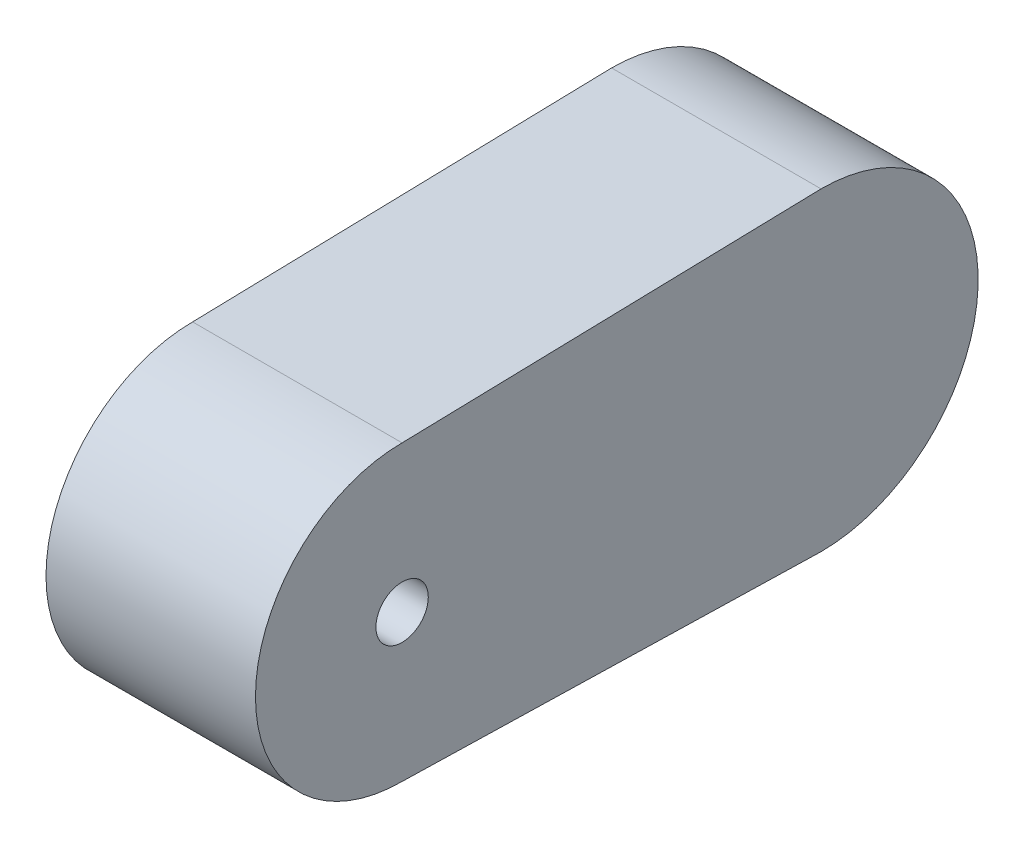
ISO-10303-21;
HEADER;
FILE_DESCRIPTION(('STEP AP214'),'2;1');
FILE_NAME('part.step','',(''),(''),'','','');
FILE_SCHEMA(('AUTOMOTIVE_DESIGN { 1 0 10303 214 1 1 1 1 }'));
ENDSEC;
DATA;
#1=APPLICATION_CONTEXT('core data for automotive mechanical design processes');
#2=APPLICATION_PROTOCOL_DEFINITION('international standard','automotive_design',2000,#1);
#3=PRODUCT_CONTEXT('',#1,'mechanical');
#4=PRODUCT('Part','Part','',(#3));
#5=PRODUCT_RELATED_PRODUCT_CATEGORY('part','',(#4));
#6=PRODUCT_DEFINITION_FORMATION('','',#4);
#7=PRODUCT_DEFINITION_CONTEXT('part definition',#1,'design');
#8=PRODUCT_DEFINITION('design','',#6,#7);
#9=PRODUCT_DEFINITION_SHAPE('','',#8);
#10=(LENGTH_UNIT() NAMED_UNIT(*) SI_UNIT(.MILLI.,.METRE.));
#11=(NAMED_UNIT(*) PLANE_ANGLE_UNIT() SI_UNIT($,.RADIAN.));
#12=(NAMED_UNIT(*) SI_UNIT($,.STERADIAN.) SOLID_ANGLE_UNIT());
#13=UNCERTAINTY_MEASURE_WITH_UNIT(LENGTH_MEASURE(1.E-05),#10,'distance_accuracy_value','');
#14=(GEOMETRIC_REPRESENTATION_CONTEXT(3) GLOBAL_UNCERTAINTY_ASSIGNED_CONTEXT((#13)) GLOBAL_UNIT_ASSIGNED_CONTEXT((#10,
#11,#12)) REPRESENTATION_CONTEXT('',''));
#15=CARTESIAN_POINT('',(0.,0.,0.));
#16=DIRECTION('',(0.,0.,1.));
#17=DIRECTION('',(1.,0.,0.));
#18=AXIS2_PLACEMENT_3D('',#15,#16,#17);
#19=CARTESIAN_POINT('',(10.,0.,0.));
#20=DIRECTION('',(1.,0.,0.));
#21=DIRECTION('',(0.,0.,-1.));
#22=AXIS2_PLACEMENT_3D('',#19,#20,#21);
#23=PLANE('',#22);
#24=CARTESIAN_POINT('',(10.,0.,0.));
#25=DIRECTION('',(1.,0.,0.));
#26=DIRECTION('',(0.,0.,-1.));
#27=AXIS2_PLACEMENT_3D('',#24,#25,#26);
#28=CIRCLE('',#27,14.);
#29=CARTESIAN_POINT('',(10.,14.,0.));
#30=VERTEX_POINT('',#29);
#31=CARTESIAN_POINT('',(10.,-14.,0.));
#32=VERTEX_POINT('',#31);
#33=EDGE_CURVE('E85',#30,#32,#28,.T.);
#34=ORIENTED_EDGE('',*,*,#33,.T.);
#35=DIRECTION('',(0.,-0.024992191160203,-0.999687646408123));
#36=VECTOR('',#35,1.);
#37=CARTESIAN_POINT('',(10.,-14.,0.));
#38=LINE('',#37,#36);
#39=CARTESIAN_POINT('',(10.,-15.,-40.));
#40=VERTEX_POINT('',#39);
#41=EDGE_CURVE('E80',#32,#40,#38,.T.);
#42=ORIENTED_EDGE('',*,*,#41,.T.);
#43=CARTESIAN_POINT('',(10.,0.,-40.));
#44=DIRECTION('',(1.,0.,0.));
#45=DIRECTION('',(0.,0.,-1.));
#46=AXIS2_PLACEMENT_3D('',#43,#44,#45);
#47=CIRCLE('',#46,15.);
#48=CARTESIAN_POINT('',(10.,15.,-40.));
#49=VERTEX_POINT('',#48);
#50=EDGE_CURVE('E83',#40,#49,#47,.T.);
#51=ORIENTED_EDGE('',*,*,#50,.T.);
#52=DIRECTION('',(0.,-0.024992191160203,0.999687646408123));
#53=VECTOR('',#52,1.);
#54=CARTESIAN_POINT('',(10.,14.,0.));
#55=LINE('',#54,#53);
#56=EDGE_CURVE('E50',#49,#30,#55,.T.);
#57=ORIENTED_EDGE('',*,*,#56,.T.);
#58=EDGE_LOOP('',(#34,#42,#51,#57));
#59=FACE_BOUND('',#58,.T.);
#60=CARTESIAN_POINT('',(10.,0.,0.));
#61=DIRECTION('',(1.,0.,0.));
#62=DIRECTION('',(0.,0.,-1.));
#63=AXIS2_PLACEMENT_3D('',#60,#61,#62);
#64=CIRCLE('',#63,2.5);
#65=CARTESIAN_POINT('',(10.,0.,-2.5));
#66=VERTEX_POINT('',#65);
#67=EDGE_CURVE('E100',#66,#66,#64,.T.);
#68=ORIENTED_EDGE('',*,*,#67,.F.);
#69=EDGE_LOOP('',(#68));
#70=FACE_BOUND('',#69,.T.);
#71=ADVANCED_FACE('F33',(#59,#70),#23,.T.);
#72=CARTESIAN_POINT('',(-10.,0.,0.));
#73=DIRECTION('',(1.,0.,0.));
#74=DIRECTION('',(0.,0.,-1.));
#75=AXIS2_PLACEMENT_3D('',#72,#73,#74);
#76=PLANE('',#75);
#77=CARTESIAN_POINT('',(-10.,0.,0.));
#78=DIRECTION('',(1.,0.,0.));
#79=DIRECTION('',(0.,0.,-1.));
#80=AXIS2_PLACEMENT_3D('',#77,#78,#79);
#81=CIRCLE('',#80,14.);
#82=CARTESIAN_POINT('',(-10.,14.,0.));
#83=VERTEX_POINT('',#82);
#84=CARTESIAN_POINT('',(-10.,-14.,0.));
#85=VERTEX_POINT('',#84);
#86=EDGE_CURVE('E97',#83,#85,#81,.T.);
#87=ORIENTED_EDGE('',*,*,#86,.F.);
#88=DIRECTION('',(0.,-0.024992191160203,0.999687646408123));
#89=VECTOR('',#88,1.);
#90=CARTESIAN_POINT('',(-10.,14.,0.));
#91=LINE('',#90,#89);
#92=CARTESIAN_POINT('',(-10.,15.,-40.));
#93=VERTEX_POINT('',#92);
#94=EDGE_CURVE('E73',#93,#83,#91,.T.);
#95=ORIENTED_EDGE('',*,*,#94,.F.);
#96=CARTESIAN_POINT('',(-10.,0.,-40.));
#97=DIRECTION('',(1.,0.,0.));
#98=DIRECTION('',(0.,0.,-1.));
#99=AXIS2_PLACEMENT_3D('',#96,#97,#98);
#100=CIRCLE('',#99,15.);
#101=CARTESIAN_POINT('',(-10.,-15.,-40.));
#102=VERTEX_POINT('',#101);
#103=EDGE_CURVE('E67',#102,#93,#100,.T.);
#104=ORIENTED_EDGE('',*,*,#103,.F.);
#105=DIRECTION('',(0.,-0.024992191160203,-0.999687646408123));
#106=VECTOR('',#105,1.);
#107=CARTESIAN_POINT('',(-10.,-14.,0.));
#108=LINE('',#107,#106);
#109=EDGE_CURVE('E89',#85,#102,#108,.T.);
#110=ORIENTED_EDGE('',*,*,#109,.F.);
#111=EDGE_LOOP('',(#87,#95,#104,#110));
#112=FACE_BOUND('',#111,.T.);
#113=CARTESIAN_POINT('',(-10.,0.,0.));
#114=DIRECTION('',(1.,0.,0.));
#115=DIRECTION('',(0.,0.,-1.));
#116=AXIS2_PLACEMENT_3D('',#113,#114,#115);
#117=CIRCLE('',#116,2.5);
#118=CARTESIAN_POINT('',(-10.,0.,-2.5));
#119=VERTEX_POINT('',#118);
#120=EDGE_CURVE('E112',#119,#119,#117,.T.);
#121=ORIENTED_EDGE('',*,*,#120,.T.);
#122=EDGE_LOOP('',(#121));
#123=FACE_BOUND('',#122,.T.);
#124=ADVANCED_FACE('F108',(#112,#123),#76,.F.);
#125=CARTESIAN_POINT('',(10.,0.,0.));
#126=DIRECTION('',(-1.,0.,0.));
#127=DIRECTION('',(0.,0.,1.));
#128=AXIS2_PLACEMENT_3D('',#125,#126,#127);
#129=CYLINDRICAL_SURFACE('',#128,14.);
#130=ORIENTED_EDGE('',*,*,#86,.T.);
#131=DIRECTION('',(-1.,0.,0.));
#132=VECTOR('',#131,1.);
#133=CARTESIAN_POINT('',(10.,-14.,0.));
#134=LINE('',#133,#132);
#135=EDGE_CURVE('E11',#32,#85,#134,.T.);
#136=ORIENTED_EDGE('',*,*,#135,.F.);
#137=ORIENTED_EDGE('',*,*,#33,.F.);
#138=DIRECTION('',(-1.,0.,0.));
#139=VECTOR('',#138,1.);
#140=CARTESIAN_POINT('',(10.,14.,0.));
#141=LINE('',#140,#139);
#142=EDGE_CURVE('E93',#30,#83,#141,.T.);
#143=ORIENTED_EDGE('',*,*,#142,.T.);
#144=EDGE_LOOP('',(#130,#136,#137,#143));
#145=FACE_BOUND('',#144,.T.);
#146=ADVANCED_FACE('F35',(#145),#129,.T.);
#147=CARTESIAN_POINT('',(10.,-14.,0.));
#148=DIRECTION('',(0.,0.999687646408123,-0.024992191160203));
#149=DIRECTION('',(0.,0.024992191160203,0.999687646408123));
#150=AXIS2_PLACEMENT_3D('',#147,#148,#149);
#151=PLANE('',#150);
#152=ORIENTED_EDGE('',*,*,#109,.T.);
#153=DIRECTION('',(-1.,0.,0.));
#154=VECTOR('',#153,1.);
#155=CARTESIAN_POINT('',(10.,-15.,-40.));
#156=LINE('',#155,#154);
#157=EDGE_CURVE('E42',#40,#102,#156,.T.);
#158=ORIENTED_EDGE('',*,*,#157,.F.);
#159=ORIENTED_EDGE('',*,*,#41,.F.);
#160=ORIENTED_EDGE('',*,*,#135,.T.);
#161=EDGE_LOOP('',(#152,#158,#159,#160));
#162=FACE_BOUND('',#161,.T.);
#163=ADVANCED_FACE('F88',(#162),#151,.F.);
#164=CARTESIAN_POINT('',(10.,0.,-40.));
#165=DIRECTION('',(-1.,0.,0.));
#166=DIRECTION('',(0.,0.,1.));
#167=AXIS2_PLACEMENT_3D('',#164,#165,#166);
#168=CYLINDRICAL_SURFACE('',#167,15.);
#169=ORIENTED_EDGE('',*,*,#103,.T.);
#170=DIRECTION('',(-1.,0.,0.));
#171=VECTOR('',#170,1.);
#172=CARTESIAN_POINT('',(10.,15.,-40.));
#173=LINE('',#172,#171);
#174=EDGE_CURVE('E90',#49,#93,#173,.T.);
#175=ORIENTED_EDGE('',*,*,#174,.F.);
#176=ORIENTED_EDGE('',*,*,#50,.F.);
#177=ORIENTED_EDGE('',*,*,#157,.T.);
#178=EDGE_LOOP('',(#169,#175,#176,#177));
#179=FACE_BOUND('',#178,.T.);
#180=ADVANCED_FACE('F91',(#179),#168,.T.);
#181=CARTESIAN_POINT('',(10.,14.,0.));
#182=DIRECTION('',(0.,-0.999687646408123,-0.024992191160203));
#183=DIRECTION('',(0.,0.024992191160203,-0.999687646408123));
#184=AXIS2_PLACEMENT_3D('',#181,#182,#183);
#185=PLANE('',#184);
#186=ORIENTED_EDGE('',*,*,#94,.T.);
#187=ORIENTED_EDGE('',*,*,#142,.F.);
#188=ORIENTED_EDGE('',*,*,#56,.F.);
#189=ORIENTED_EDGE('',*,*,#174,.T.);
#190=EDGE_LOOP('',(#186,#187,#188,#189));
#191=FACE_BOUND('',#190,.T.);
#192=ADVANCED_FACE('F105',(#191),#185,.F.);
#193=CARTESIAN_POINT('',(10.,0.,0.));
#194=DIRECTION('',(-1.,0.,0.));
#195=DIRECTION('',(0.,0.,1.));
#196=AXIS2_PLACEMENT_3D('',#193,#194,#195);
#197=CYLINDRICAL_SURFACE('',#196,2.5);
#198=ORIENTED_EDGE('',*,*,#67,.T.);
#199=EDGE_LOOP('',(#198));
#200=FACE_BOUND('',#199,.T.);
#201=ORIENTED_EDGE('',*,*,#120,.F.);
#202=EDGE_LOOP('',(#201));
#203=FACE_BOUND('',#202,.T.);
#204=ADVANCED_FACE('F118',(#200,#203),#197,.F.);
#205=CLOSED_SHELL('',(#71,#124,#146,#163,#180,#192,#204));
#206=MANIFOLD_SOLID_BREP('B2',#205);
#207=ADVANCED_BREP_SHAPE_REPRESENTATION('',(#18,#206),#14);
#208=SHAPE_DEFINITION_REPRESENTATION(#9,#207);
ENDSEC;
END-ISO-10303-21;
